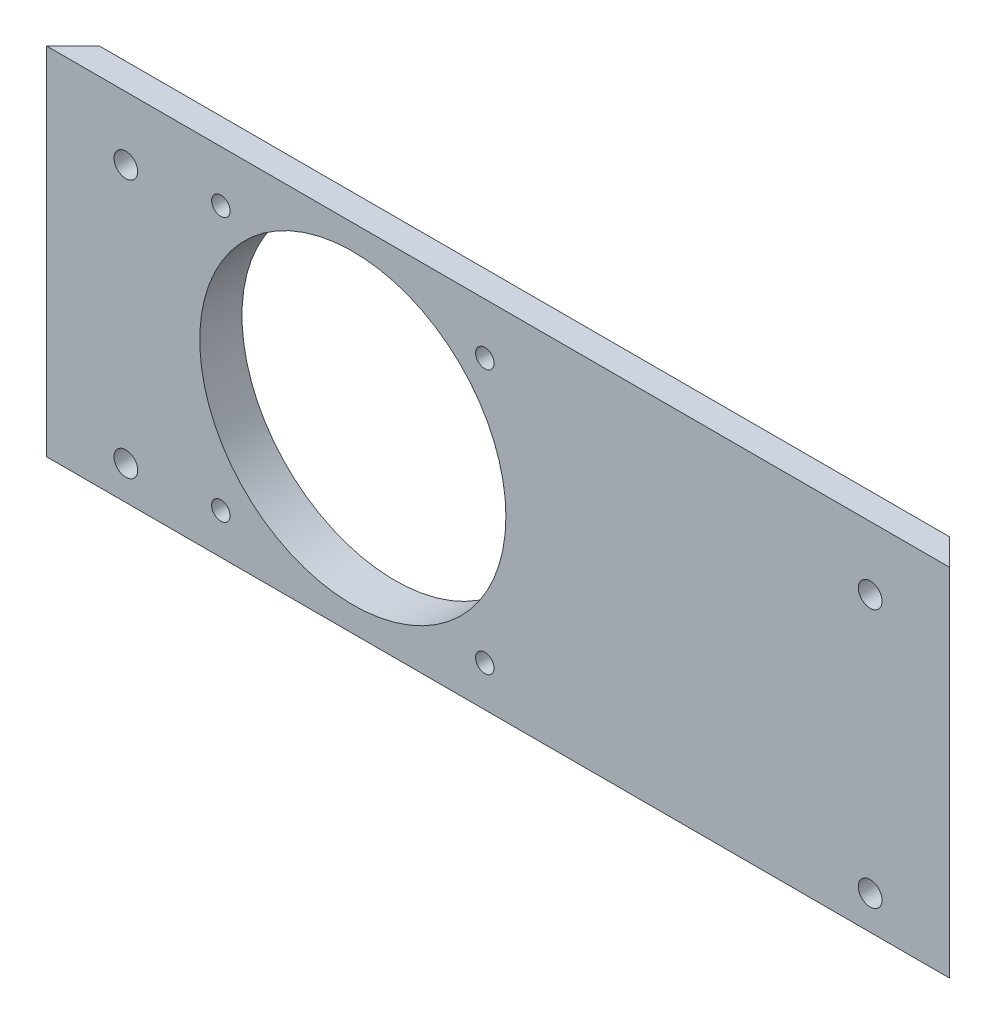
ISO-10303-21;
HEADER;
FILE_DESCRIPTION(('STEP AP214'),'2;1');
FILE_NAME('part.step','',(''),(''),'','','');
FILE_SCHEMA(('AUTOMOTIVE_DESIGN { 1 0 10303 214 1 1 1 1 }'));
ENDSEC;
DATA;
#1=APPLICATION_CONTEXT('core data for automotive mechanical design processes');
#2=APPLICATION_PROTOCOL_DEFINITION('international standard','automotive_design',2000,#1);
#3=PRODUCT_CONTEXT('',#1,'mechanical');
#4=PRODUCT('Part','Part','',(#3));
#5=PRODUCT_RELATED_PRODUCT_CATEGORY('part','',(#4));
#6=PRODUCT_DEFINITION_FORMATION('','',#4);
#7=PRODUCT_DEFINITION_CONTEXT('part definition',#1,'design');
#8=PRODUCT_DEFINITION('design','',#6,#7);
#9=PRODUCT_DEFINITION_SHAPE('','',#8);
#10=(LENGTH_UNIT() NAMED_UNIT(*) SI_UNIT(.MILLI.,.METRE.));
#11=(NAMED_UNIT(*) PLANE_ANGLE_UNIT() SI_UNIT($,.RADIAN.));
#12=(NAMED_UNIT(*) SI_UNIT($,.STERADIAN.) SOLID_ANGLE_UNIT());
#13=UNCERTAINTY_MEASURE_WITH_UNIT(LENGTH_MEASURE(1.E-05),#10,'distance_accuracy_value','');
#14=(GEOMETRIC_REPRESENTATION_CONTEXT(3) GLOBAL_UNCERTAINTY_ASSIGNED_CONTEXT((#13)) GLOBAL_UNIT_ASSIGNED_CONTEXT((#10,
#11,#12)) REPRESENTATION_CONTEXT('',''));
#15=CARTESIAN_POINT('',(0.,0.,0.));
#16=DIRECTION('',(0.,0.,1.));
#17=DIRECTION('',(1.,0.,0.));
#18=AXIS2_PLACEMENT_3D('',#15,#16,#17);
#19=CARTESIAN_POINT('',(0.,70.,-5.));
#20=DIRECTION('',(0.,1.,0.));
#21=DIRECTION('',(0.,0.,1.));
#22=AXIS2_PLACEMENT_3D('',#19,#20,#21);
#23=PLANE('',#22);
#24=DIRECTION('',(-0.707106781186546,0.,-0.707106781186549));
#25=VECTOR('',#24,1.);
#26=CARTESIAN_POINT('',(83.0000000000003,70.,-88.));
#27=LINE('',#26,#25);
#28=CARTESIAN_POINT('',(171.,70.,0.));
#29=VERTEX_POINT('',#28);
#30=CARTESIAN_POINT('',(166.,70.,-4.99999999999999));
#31=VERTEX_POINT('',#30);
#32=EDGE_CURVE('E130',#29,#31,#27,.T.);
#33=ORIENTED_EDGE('',*,*,#32,.T.);
#34=DIRECTION('',(-1.,0.,0.));
#35=VECTOR('',#34,1.);
#36=CARTESIAN_POINT('',(8.00000000000001,70.,-5.));
#37=LINE('',#36,#35);
#38=CARTESIAN_POINT('',(5.00000000000002,70.,-5.));
#39=VERTEX_POINT('',#38);
#40=EDGE_CURVE('E65',#31,#39,#37,.T.);
#41=ORIENTED_EDGE('',*,*,#40,.T.);
#42=DIRECTION('',(-0.707106781186546,0.,0.707106781186549));
#43=VECTOR('',#42,1.);
#44=CARTESIAN_POINT('',(2.50000000000002,70.,-2.49999999999999));
#45=LINE('',#44,#43);
#46=CARTESIAN_POINT('',(0.,70.,0.));
#47=VERTEX_POINT('',#46);
#48=EDGE_CURVE('E125',#39,#47,#45,.T.);
#49=ORIENTED_EDGE('',*,*,#48,.T.);
#50=DIRECTION('',(-1.,0.,0.));
#51=VECTOR('',#50,1.);
#52=CARTESIAN_POINT('',(0.,70.,0.));
#53=LINE('',#52,#51);
#54=EDGE_CURVE('E166',#29,#47,#53,.T.);
#55=ORIENTED_EDGE('',*,*,#54,.F.);
#56=EDGE_LOOP('',(#33,#41,#49,#55));
#57=FACE_BOUND('',#56,.T.);
#58=ADVANCED_FACE('F41',(#57),#23,.T.);
#59=CARTESIAN_POINT('',(0.,0.,-5.));
#60=DIRECTION('',(0.,0.,-1.));
#61=DIRECTION('',(-1.,0.,0.));
#62=AXIS2_PLACEMENT_3D('',#59,#60,#61);
#63=PLANE('',#62);
#64=DIRECTION('',(1.,0.,0.));
#65=VECTOR('',#64,1.);
#66=CARTESIAN_POINT('',(-5.,2.59999999999997,-4.99999999999988));
#67=LINE('',#66,#65);
#68=CARTESIAN_POINT('',(4.9999999999999,2.59999999999997,-4.99999999999988));
#69=VERTEX_POINT('',#68);
#70=CARTESIAN_POINT('',(166.,2.59999999999997,-4.99999999999988));
#71=VERTEX_POINT('',#70);
#72=EDGE_CURVE('E100',#69,#71,#67,.T.);
#73=ORIENTED_EDGE('',*,*,#72,.F.);
#74=DIRECTION('',(0.,1.,0.));
#75=VECTOR('',#74,1.);
#76=CARTESIAN_POINT('',(5.00000000000002,0.,-5.));
#77=LINE('',#76,#75);
#78=CARTESIAN_POINT('',(5.00000000000002,5.,-5.));
#79=VERTEX_POINT('',#78);
#80=EDGE_CURVE('E126',#69,#79,#77,.T.);
#81=ORIENTED_EDGE('',*,*,#80,.T.);
#82=DIRECTION('',(-1.,0.,0.));
#83=VECTOR('',#82,1.);
#84=CARTESIAN_POINT('',(0.,5.,-5.));
#85=LINE('',#84,#83);
#86=CARTESIAN_POINT('',(166.,4.99999999999997,-5.));
#87=VERTEX_POINT('',#86);
#88=EDGE_CURVE('E123',#87,#79,#85,.T.);
#89=ORIENTED_EDGE('',*,*,#88,.F.);
#90=DIRECTION('',(0.,-1.,0.));
#91=VECTOR('',#90,1.);
#92=CARTESIAN_POINT('',(166.,0.,-5.));
#93=LINE('',#92,#91);
#94=EDGE_CURVE('E114',#87,#71,#93,.T.);
#95=ORIENTED_EDGE('',*,*,#94,.T.);
#96=EDGE_LOOP('',(#73,#81,#89,#95));
#97=FACE_BOUND('',#96,.T.);
#98=ADVANCED_FACE('F121',(#97),#63,.T.);
#99=CARTESIAN_POINT('',(0.,0.,0.));
#100=DIRECTION('',(0.,0.,-1.));
#101=DIRECTION('',(-1.,0.,0.));
#102=AXIS2_PLACEMENT_3D('',#99,#100,#101);
#103=PLANE('',#102);
#104=CARTESIAN_POINT('',(33.0000000000004,10.3,0.));
#105=DIRECTION('',(0.,0.,1.));
#106=DIRECTION('',(1.,0.,0.));
#107=AXIS2_PLACEMENT_3D('',#104,#105,#106);
#108=CIRCLE('',#107,1.75);
#109=CARTESIAN_POINT('',(34.7500000000004,10.3,0.));
#110=VERTEX_POINT('',#109);
#111=EDGE_CURVE('E374',#110,#110,#108,.T.);
#112=ORIENTED_EDGE('',*,*,#111,.F.);
#113=EDGE_LOOP('',(#112));
#114=FACE_BOUND('',#113,.T.);
#115=CARTESIAN_POINT('',(83.0000000000004,10.3,0.));
#116=DIRECTION('',(0.,0.,1.));
#117=DIRECTION('',(1.,0.,0.));
#118=AXIS2_PLACEMENT_3D('',#115,#116,#117);
#119=CIRCLE('',#118,1.75);
#120=CARTESIAN_POINT('',(84.7500000000004,10.3,0.));
#121=VERTEX_POINT('',#120);
#122=EDGE_CURVE('E378',#121,#121,#119,.T.);
#123=ORIENTED_EDGE('',*,*,#122,.F.);
#124=EDGE_LOOP('',(#123));
#125=FACE_BOUND('',#124,.T.);
#126=CARTESIAN_POINT('',(82.9999999999999,60.3,0.));
#127=DIRECTION('',(0.,0.,1.));
#128=DIRECTION('',(1.,0.,0.));
#129=AXIS2_PLACEMENT_3D('',#126,#127,#128);
#130=CIRCLE('',#129,1.75);
#131=CARTESIAN_POINT('',(84.7499999999999,60.3,0.));
#132=VERTEX_POINT('',#131);
#133=EDGE_CURVE('E404',#132,#132,#130,.T.);
#134=ORIENTED_EDGE('',*,*,#133,.F.);
#135=EDGE_LOOP('',(#134));
#136=FACE_BOUND('',#135,.T.);
#137=CARTESIAN_POINT('',(32.9999999999999,60.3,0.));
#138=DIRECTION('',(0.,0.,1.));
#139=DIRECTION('',(1.,0.,0.));
#140=AXIS2_PLACEMENT_3D('',#137,#138,#139);
#141=CIRCLE('',#140,1.75);
#142=CARTESIAN_POINT('',(34.7499999999999,60.3,0.));
#143=VERTEX_POINT('',#142);
#144=EDGE_CURVE('E392',#143,#143,#141,.T.);
#145=ORIENTED_EDGE('',*,*,#144,.F.);
#146=EDGE_LOOP('',(#145));
#147=FACE_BOUND('',#146,.T.);
#148=CARTESIAN_POINT('',(57.9999999999999,36.3,0.));
#149=DIRECTION('',(0.,0.,1.));
#150=DIRECTION('',(1.,0.,0.));
#151=AXIS2_PLACEMENT_3D('',#148,#149,#150);
#152=CIRCLE('',#151,29.);
#153=CARTESIAN_POINT('',(86.9999999999999,36.3,0.));
#154=VERTEX_POINT('',#153);
#155=EDGE_CURVE('E384',#154,#154,#152,.T.);
#156=ORIENTED_EDGE('',*,*,#155,.F.);
#157=EDGE_LOOP('',(#156));
#158=FACE_BOUND('',#157,.T.);
#159=CARTESIAN_POINT('',(156.,58.,0.));
#160=DIRECTION('',(0.,0.,1.));
#161=DIRECTION('',(-1.,0.,0.));
#162=AXIS2_PLACEMENT_3D('',#159,#160,#161);
#163=CIRCLE('',#162,2.25000000000004);
#164=CARTESIAN_POINT('',(153.75,58.,0.));
#165=VERTEX_POINT('',#164);
#166=EDGE_CURVE('E187',#165,#165,#163,.T.);
#167=ORIENTED_EDGE('',*,*,#166,.F.);
#168=EDGE_LOOP('',(#167));
#169=FACE_BOUND('',#168,.T.);
#170=CARTESIAN_POINT('',(15.,58.,0.));
#171=DIRECTION('',(0.,0.,1.));
#172=DIRECTION('',(1.,0.,0.));
#173=AXIS2_PLACEMENT_3D('',#170,#171,#172);
#174=CIRCLE('',#173,2.25);
#175=CARTESIAN_POINT('',(17.25,58.,0.));
#176=VERTEX_POINT('',#175);
#177=EDGE_CURVE('E192',#176,#176,#174,.T.);
#178=ORIENTED_EDGE('',*,*,#177,.F.);
#179=EDGE_LOOP('',(#178));
#180=FACE_BOUND('',#179,.T.);
#181=CARTESIAN_POINT('',(156.,9.,0.));
#182=DIRECTION('',(0.,0.,1.));
#183=DIRECTION('',(-1.,0.,0.));
#184=AXIS2_PLACEMENT_3D('',#181,#182,#183);
#185=CIRCLE('',#184,2.25000000000004);
#186=CARTESIAN_POINT('',(153.75,9.,0.));
#187=VERTEX_POINT('',#186);
#188=EDGE_CURVE('E202',#187,#187,#185,.T.);
#189=ORIENTED_EDGE('',*,*,#188,.F.);
#190=EDGE_LOOP('',(#189));
#191=FACE_BOUND('',#190,.T.);
#192=CARTESIAN_POINT('',(15.,9.,0.));
#193=DIRECTION('',(0.,0.,1.));
#194=DIRECTION('',(1.,0.,0.));
#195=AXIS2_PLACEMENT_3D('',#192,#193,#194);
#196=CIRCLE('',#195,2.25);
#197=CARTESIAN_POINT('',(17.25,9.,0.));
#198=VERTEX_POINT('',#197);
#199=EDGE_CURVE('E206',#198,#198,#196,.T.);
#200=ORIENTED_EDGE('',*,*,#199,.F.);
#201=EDGE_LOOP('',(#200));
#202=FACE_BOUND('',#201,.T.);
#203=DIRECTION('',(0.,-1.,0.));
#204=VECTOR('',#203,1.);
#205=CARTESIAN_POINT('',(0.,0.,0.));
#206=LINE('',#205,#204);
#207=CARTESIAN_POINT('',(0.,2.59999999999997,0.));
#208=VERTEX_POINT('',#207);
#209=EDGE_CURVE('E175',#47,#208,#206,.T.);
#210=ORIENTED_EDGE('',*,*,#209,.T.);
#211=DIRECTION('',(1.,0.,0.));
#212=VECTOR('',#211,1.);
#213=CARTESIAN_POINT('',(0.,2.59999999999997,1.38777878078145E-13));
#214=LINE('',#213,#212);
#215=CARTESIAN_POINT('',(171.,2.59999999999997,1.38777878078145E-13));
#216=VERTEX_POINT('',#215);
#217=EDGE_CURVE('E57',#208,#216,#214,.T.);
#218=ORIENTED_EDGE('',*,*,#217,.T.);
#219=DIRECTION('',(0.,1.,0.));
#220=VECTOR('',#219,1.);
#221=CARTESIAN_POINT('',(171.,0.,0.));
#222=LINE('',#221,#220);
#223=EDGE_CURVE('E116',#216,#29,#222,.T.);
#224=ORIENTED_EDGE('',*,*,#223,.T.);
#225=ORIENTED_EDGE('',*,*,#54,.T.);
#226=EDGE_LOOP('',(#210,#218,#224,#225));
#227=FACE_BOUND('',#226,.T.);
#228=ADVANCED_FACE('F210',(#114,#125,#136,#147,#158,#169,#180,#191,#202,#227),#103,.F.);
#229=CARTESIAN_POINT('',(15.,9.,-5.));
#230=DIRECTION('',(0.,0.,1.));
#231=DIRECTION('',(1.,0.,0.));
#232=AXIS2_PLACEMENT_3D('',#229,#230,#231);
#233=CYLINDRICAL_SURFACE('',#232,2.25);
#234=ORIENTED_EDGE('',*,*,#199,.T.);
#235=EDGE_LOOP('',(#234));
#236=FACE_BOUND('',#235,.T.);
#237=CARTESIAN_POINT('',(15.,9.,-8.));
#238=DIRECTION('',(0.,0.,-1.));
#239=DIRECTION('',(-1.,0.,0.));
#240=AXIS2_PLACEMENT_3D('',#237,#238,#239);
#241=CIRCLE('',#240,2.25);
#242=CARTESIAN_POINT('',(12.75,9.,-8.));
#243=VERTEX_POINT('',#242);
#244=EDGE_CURVE('E222',#243,#243,#241,.T.);
#245=ORIENTED_EDGE('',*,*,#244,.T.);
#246=EDGE_LOOP('',(#245));
#247=FACE_BOUND('',#246,.T.);
#248=ADVANCED_FACE('F313',(#236,#247),#233,.F.);
#249=CARTESIAN_POINT('',(156.,9.,-5.));
#250=DIRECTION('',(0.,0.,1.));
#251=DIRECTION('',(1.,0.,0.));
#252=AXIS2_PLACEMENT_3D('',#249,#250,#251);
#253=CYLINDRICAL_SURFACE('',#252,2.25000000000004);
#254=ORIENTED_EDGE('',*,*,#188,.T.);
#255=EDGE_LOOP('',(#254));
#256=FACE_BOUND('',#255,.T.);
#257=CARTESIAN_POINT('',(156.,9.,-8.));
#258=DIRECTION('',(0.,0.,-1.));
#259=DIRECTION('',(-1.,0.,0.));
#260=AXIS2_PLACEMENT_3D('',#257,#258,#259);
#261=CIRCLE('',#260,2.25000000000004);
#262=CARTESIAN_POINT('',(153.75,9.,-8.));
#263=VERTEX_POINT('',#262);
#264=EDGE_CURVE('E216',#263,#263,#261,.T.);
#265=ORIENTED_EDGE('',*,*,#264,.T.);
#266=EDGE_LOOP('',(#265));
#267=FACE_BOUND('',#266,.T.);
#268=ADVANCED_FACE('F248',(#256,#267),#253,.F.);
#269=CARTESIAN_POINT('',(15.,58.,-5.));
#270=DIRECTION('',(0.,0.,1.));
#271=DIRECTION('',(1.,0.,0.));
#272=AXIS2_PLACEMENT_3D('',#269,#270,#271);
#273=CYLINDRICAL_SURFACE('',#272,2.25);
#274=ORIENTED_EDGE('',*,*,#177,.T.);
#275=EDGE_LOOP('',(#274));
#276=FACE_BOUND('',#275,.T.);
#277=CARTESIAN_POINT('',(15.,58.,-8.));
#278=DIRECTION('',(0.,0.,-1.));
#279=DIRECTION('',(-1.,0.,0.));
#280=AXIS2_PLACEMENT_3D('',#277,#278,#279);
#281=CIRCLE('',#280,2.25000000000001);
#282=CARTESIAN_POINT('',(12.75,58.,-8.));
#283=VERTEX_POINT('',#282);
#284=EDGE_CURVE('E194',#283,#283,#281,.T.);
#285=ORIENTED_EDGE('',*,*,#284,.T.);
#286=EDGE_LOOP('',(#285));
#287=FACE_BOUND('',#286,.T.);
#288=ADVANCED_FACE('F231',(#276,#287),#273,.F.);
#289=CARTESIAN_POINT('',(156.,58.,-5.));
#290=DIRECTION('',(0.,0.,1.));
#291=DIRECTION('',(1.,0.,0.));
#292=AXIS2_PLACEMENT_3D('',#289,#290,#291);
#293=CYLINDRICAL_SURFACE('',#292,2.25000000000004);
#294=ORIENTED_EDGE('',*,*,#166,.T.);
#295=EDGE_LOOP('',(#294));
#296=FACE_BOUND('',#295,.T.);
#297=CARTESIAN_POINT('',(156.,58.,-8.));
#298=DIRECTION('',(0.,0.,-1.));
#299=DIRECTION('',(-1.,0.,0.));
#300=AXIS2_PLACEMENT_3D('',#297,#298,#299);
#301=CIRCLE('',#300,2.25000000000004);
#302=CARTESIAN_POINT('',(153.75,58.,-8.));
#303=VERTEX_POINT('',#302);
#304=EDGE_CURVE('E212',#303,#303,#301,.T.);
#305=ORIENTED_EDGE('',*,*,#304,.T.);
#306=EDGE_LOOP('',(#305));
#307=FACE_BOUND('',#306,.T.);
#308=ADVANCED_FACE('F234',(#296,#307),#293,.F.);
#309=CARTESIAN_POINT('',(0.,0.,-8.));
#310=DIRECTION('',(0.,0.,1.));
#311=DIRECTION('',(1.,0.,0.));
#312=AXIS2_PLACEMENT_3D('',#309,#310,#311);
#313=PLANE('',#312);
#314=CARTESIAN_POINT('',(33.0000000000004,10.3,-8.));
#315=DIRECTION('',(0.,0.,1.));
#316=DIRECTION('',(1.,0.,0.));
#317=AXIS2_PLACEMENT_3D('',#314,#315,#316);
#318=CIRCLE('',#317,1.75);
#319=CARTESIAN_POINT('',(34.7500000000004,10.3,-8.));
#320=VERTEX_POINT('',#319);
#321=EDGE_CURVE('E371',#320,#320,#318,.T.);
#322=ORIENTED_EDGE('',*,*,#321,.T.);
#323=EDGE_LOOP('',(#322));
#324=FACE_BOUND('',#323,.T.);
#325=CARTESIAN_POINT('',(83.0000000000004,10.3,-8.));
#326=DIRECTION('',(0.,0.,1.));
#327=DIRECTION('',(1.,0.,0.));
#328=AXIS2_PLACEMENT_3D('',#325,#326,#327);
#329=CIRCLE('',#328,1.75);
#330=CARTESIAN_POINT('',(84.7500000000004,10.3,-8.));
#331=VERTEX_POINT('',#330);
#332=EDGE_CURVE('E408',#331,#331,#329,.T.);
#333=ORIENTED_EDGE('',*,*,#332,.T.);
#334=EDGE_LOOP('',(#333));
#335=FACE_BOUND('',#334,.T.);
#336=CARTESIAN_POINT('',(82.9999999999999,60.3,-8.));
#337=DIRECTION('',(0.,0.,1.));
#338=DIRECTION('',(1.,0.,0.));
#339=AXIS2_PLACEMENT_3D('',#336,#337,#338);
#340=CIRCLE('',#339,1.75);
#341=CARTESIAN_POINT('',(84.7499999999999,60.3,-8.));
#342=VERTEX_POINT('',#341);
#343=EDGE_CURVE('E398',#342,#342,#340,.T.);
#344=ORIENTED_EDGE('',*,*,#343,.T.);
#345=EDGE_LOOP('',(#344));
#346=FACE_BOUND('',#345,.T.);
#347=CARTESIAN_POINT('',(32.9999999999999,60.3,-8.));
#348=DIRECTION('',(0.,0.,1.));
#349=DIRECTION('',(1.,0.,0.));
#350=AXIS2_PLACEMENT_3D('',#347,#348,#349);
#351=CIRCLE('',#350,1.75);
#352=CARTESIAN_POINT('',(34.7499999999999,60.3,-8.));
#353=VERTEX_POINT('',#352);
#354=EDGE_CURVE('E387',#353,#353,#351,.T.);
#355=ORIENTED_EDGE('',*,*,#354,.T.);
#356=EDGE_LOOP('',(#355));
#357=FACE_BOUND('',#356,.T.);
#358=CARTESIAN_POINT('',(57.9999999999999,36.3,-8.));
#359=DIRECTION('',(0.,0.,1.));
#360=DIRECTION('',(1.,0.,0.));
#361=AXIS2_PLACEMENT_3D('',#358,#359,#360);
#362=CIRCLE('',#361,29.);
#363=CARTESIAN_POINT('',(86.9999999999999,36.3,-8.));
#364=VERTEX_POINT('',#363);
#365=EDGE_CURVE('E118',#364,#364,#362,.T.);
#366=ORIENTED_EDGE('',*,*,#365,.T.);
#367=EDGE_LOOP('',(#366));
#368=FACE_BOUND('',#367,.T.);
#369=DIRECTION('',(0.,1.,0.));
#370=VECTOR('',#369,1.);
#371=CARTESIAN_POINT('',(8.00000000000001,70.,-8.));
#372=LINE('',#371,#370);
#373=CARTESIAN_POINT('',(8.00000000000001,5.,-8.));
#374=VERTEX_POINT('',#373);
#375=CARTESIAN_POINT('',(8.00000000000001,67.,-8.));
#376=VERTEX_POINT('',#375);
#377=EDGE_CURVE('E153',#374,#376,#372,.T.);
#378=ORIENTED_EDGE('',*,*,#377,.T.);
#379=DIRECTION('',(1.,0.,0.));
#380=VECTOR('',#379,1.);
#381=CARTESIAN_POINT('',(163.,67.,-8.));
#382=LINE('',#381,#380);
#383=CARTESIAN_POINT('',(163.,67.,-8.));
#384=VERTEX_POINT('',#383);
#385=EDGE_CURVE('E138',#376,#384,#382,.T.);
#386=ORIENTED_EDGE('',*,*,#385,.T.);
#387=DIRECTION('',(0.,-1.,0.));
#388=VECTOR('',#387,1.);
#389=CARTESIAN_POINT('',(163.,4.99999999999997,-8.));
#390=LINE('',#389,#388);
#391=CARTESIAN_POINT('',(163.,4.99999999999997,-8.));
#392=VERTEX_POINT('',#391);
#393=EDGE_CURVE('E165',#384,#392,#390,.T.);
#394=ORIENTED_EDGE('',*,*,#393,.T.);
#395=DIRECTION('',(-1.,0.,0.));
#396=VECTOR('',#395,1.);
#397=CARTESIAN_POINT('',(0.,5.,-8.));
#398=LINE('',#397,#396);
#399=EDGE_CURVE('E163',#392,#374,#398,.T.);
#400=ORIENTED_EDGE('',*,*,#399,.T.);
#401=EDGE_LOOP('',(#378,#386,#394,#400));
#402=FACE_BOUND('',#401,.T.);
#403=ORIENTED_EDGE('',*,*,#284,.F.);
#404=EDGE_LOOP('',(#403));
#405=FACE_BOUND('',#404,.T.);
#406=ORIENTED_EDGE('',*,*,#244,.F.);
#407=EDGE_LOOP('',(#406));
#408=FACE_BOUND('',#407,.T.);
#409=ORIENTED_EDGE('',*,*,#264,.F.);
#410=EDGE_LOOP('',(#409));
#411=FACE_BOUND('',#410,.T.);
#412=ORIENTED_EDGE('',*,*,#304,.F.);
#413=EDGE_LOOP('',(#412));
#414=FACE_BOUND('',#413,.T.);
#415=ADVANCED_FACE('F159',(#324,#335,#346,#357,#368,#402,#405,#408,#411,#414),#313,.F.);
#416=CARTESIAN_POINT('',(0.,5.,-8.));
#417=DIRECTION('',(0.,1.,0.));
#418=DIRECTION('',(-1.,0.,0.));
#419=AXIS2_PLACEMENT_3D('',#416,#417,#418);
#420=PLANE('',#419);
#421=ORIENTED_EDGE('',*,*,#399,.F.);
#422=DIRECTION('',(0.707106781186546,0.,0.707106781186549));
#423=VECTOR('',#422,1.);
#424=CARTESIAN_POINT('',(163.,4.99999999999997,-8.));
#425=LINE('',#424,#423);
#426=EDGE_CURVE('E132',#392,#87,#425,.T.);
#427=ORIENTED_EDGE('',*,*,#426,.T.);
#428=ORIENTED_EDGE('',*,*,#88,.T.);
#429=DIRECTION('',(0.707106781186546,0.,-0.707106781186549));
#430=VECTOR('',#429,1.);
#431=CARTESIAN_POINT('',(8.00000000000001,5.,-8.));
#432=LINE('',#431,#430);
#433=EDGE_CURVE('E181',#79,#374,#432,.T.);
#434=ORIENTED_EDGE('',*,*,#433,.T.);
#435=EDGE_LOOP('',(#421,#427,#428,#434));
#436=FACE_BOUND('',#435,.T.);
#437=ADVANCED_FACE('F185',(#436),#420,.F.);
#438=CARTESIAN_POINT('',(163.,0.,-8.));
#439=DIRECTION('',(0.707106781186549,0.,-0.707106781186546));
#440=DIRECTION('',(0.,1.,0.));
#441=AXIS2_PLACEMENT_3D('',#438,#439,#440);
#442=PLANE('',#441);
#443=DIRECTION('',(0.707106781186547,0.,0.707106781186549));
#444=VECTOR('',#443,1.);
#445=CARTESIAN_POINT('',(171.,2.59999999999997,1.38777878078145E-13));
#446=LINE('',#445,#444);
#447=EDGE_CURVE('E103',#71,#216,#446,.T.);
#448=ORIENTED_EDGE('',*,*,#447,.F.);
#449=ORIENTED_EDGE('',*,*,#94,.F.);
#450=ORIENTED_EDGE('',*,*,#426,.F.);
#451=ORIENTED_EDGE('',*,*,#393,.F.);
#452=DIRECTION('',(0.577350269189624,0.577350269189627,0.577350269189626));
#453=VECTOR('',#452,1.);
#454=CARTESIAN_POINT('',(140.666666666667,44.6666666666666,-30.3333333333334));
#455=LINE('',#454,#453);
#456=EDGE_CURVE('E142',#384,#31,#455,.T.);
#457=ORIENTED_EDGE('',*,*,#456,.T.);
#458=ORIENTED_EDGE('',*,*,#32,.F.);
#459=ORIENTED_EDGE('',*,*,#223,.F.);
#460=EDGE_LOOP('',(#448,#449,#450,#451,#457,#458,#459));
#461=FACE_BOUND('',#460,.T.);
#462=ADVANCED_FACE('F112',(#461),#442,.T.);
#463=CARTESIAN_POINT('',(8.00000000000001,0.,-8.));
#464=DIRECTION('',(-0.707106781186549,0.,-0.707106781186546));
#465=DIRECTION('',(0.,-1.,0.));
#466=AXIS2_PLACEMENT_3D('',#463,#464,#465);
#467=PLANE('',#466);
#468=DIRECTION('',(0.707106781186546,0.,-0.707106781186549));
#469=VECTOR('',#468,1.);
#470=CARTESIAN_POINT('',(8.00000000000001,2.59999999999997,-8.));
#471=LINE('',#470,#469);
#472=EDGE_CURVE('E11',#208,#69,#471,.T.);
#473=ORIENTED_EDGE('',*,*,#472,.F.);
#474=ORIENTED_EDGE('',*,*,#209,.F.);
#475=ORIENTED_EDGE('',*,*,#48,.F.);
#476=DIRECTION('',(0.577350269189624,-0.577350269189627,-0.577350269189626));
#477=VECTOR('',#476,1.);
#478=CARTESIAN_POINT('',(30.3333333333333,44.6666666666666,-30.3333333333334));
#479=LINE('',#478,#477);
#480=EDGE_CURVE('E51',#39,#376,#479,.T.);
#481=ORIENTED_EDGE('',*,*,#480,.T.);
#482=ORIENTED_EDGE('',*,*,#377,.F.);
#483=ORIENTED_EDGE('',*,*,#433,.F.);
#484=ORIENTED_EDGE('',*,*,#80,.F.);
#485=EDGE_LOOP('',(#473,#474,#475,#481,#482,#483,#484));
#486=FACE_BOUND('',#485,.T.);
#487=ADVANCED_FACE('F151',(#486),#467,.T.);
#488=CARTESIAN_POINT('',(0.,67.,-8.));
#489=DIRECTION('',(0.,0.707106781186547,-0.707106781186548));
#490=DIRECTION('',(-1.,0.,0.));
#491=AXIS2_PLACEMENT_3D('',#488,#489,#490);
#492=PLANE('',#491);
#493=ORIENTED_EDGE('',*,*,#480,.F.);
#494=ORIENTED_EDGE('',*,*,#40,.F.);
#495=ORIENTED_EDGE('',*,*,#456,.F.);
#496=ORIENTED_EDGE('',*,*,#385,.F.);
#497=EDGE_LOOP('',(#493,#494,#495,#496));
#498=FACE_BOUND('',#497,.T.);
#499=ADVANCED_FACE('F44',(#498),#492,.T.);
#500=CARTESIAN_POINT('',(0.,2.59999999999997,1.38777878078145E-13));
#501=DIRECTION('',(0.,1.,0.));
#502=DIRECTION('',(-1.,0.,0.));
#503=AXIS2_PLACEMENT_3D('',#500,#501,#502);
#504=PLANE('',#503);
#505=ORIENTED_EDGE('',*,*,#472,.T.);
#506=ORIENTED_EDGE('',*,*,#72,.T.);
#507=ORIENTED_EDGE('',*,*,#447,.T.);
#508=ORIENTED_EDGE('',*,*,#217,.F.);
#509=EDGE_LOOP('',(#505,#506,#507,#508));
#510=FACE_BOUND('',#509,.T.);
#511=ADVANCED_FACE('F102',(#510),#504,.F.);
#512=CARTESIAN_POINT('',(57.9999999999999,36.3,-8.));
#513=DIRECTION('',(0.,0.,1.));
#514=DIRECTION('',(1.,0.,0.));
#515=AXIS2_PLACEMENT_3D('',#512,#513,#514);
#516=CYLINDRICAL_SURFACE('',#515,29.);
#517=ORIENTED_EDGE('',*,*,#365,.F.);
#518=EDGE_LOOP('',(#517));
#519=FACE_BOUND('',#518,.T.);
#520=ORIENTED_EDGE('',*,*,#155,.T.);
#521=EDGE_LOOP('',(#520));
#522=FACE_BOUND('',#521,.T.);
#523=ADVANCED_FACE('F274',(#519,#522),#516,.F.);
#524=CARTESIAN_POINT('',(32.9999999999999,60.3,-8.));
#525=DIRECTION('',(0.,0.,1.));
#526=DIRECTION('',(1.,0.,0.));
#527=AXIS2_PLACEMENT_3D('',#524,#525,#526);
#528=CYLINDRICAL_SURFACE('',#527,1.75);
#529=ORIENTED_EDGE('',*,*,#354,.F.);
#530=EDGE_LOOP('',(#529));
#531=FACE_BOUND('',#530,.T.);
#532=ORIENTED_EDGE('',*,*,#144,.T.);
#533=EDGE_LOOP('',(#532));
#534=FACE_BOUND('',#533,.T.);
#535=ADVANCED_FACE('F279',(#531,#534),#528,.F.);
#536=CARTESIAN_POINT('',(82.9999999999999,60.3,-8.));
#537=DIRECTION('',(0.,0.,1.));
#538=DIRECTION('',(1.,0.,0.));
#539=AXIS2_PLACEMENT_3D('',#536,#537,#538);
#540=CYLINDRICAL_SURFACE('',#539,1.75);
#541=ORIENTED_EDGE('',*,*,#343,.F.);
#542=EDGE_LOOP('',(#541));
#543=FACE_BOUND('',#542,.T.);
#544=ORIENTED_EDGE('',*,*,#133,.T.);
#545=EDGE_LOOP('',(#544));
#546=FACE_BOUND('',#545,.T.);
#547=ADVANCED_FACE('F335',(#543,#546),#540,.F.);
#548=CARTESIAN_POINT('',(83.0000000000004,10.3,-8.));
#549=DIRECTION('',(0.,0.,1.));
#550=DIRECTION('',(1.,0.,0.));
#551=AXIS2_PLACEMENT_3D('',#548,#549,#550);
#552=CYLINDRICAL_SURFACE('',#551,1.75);
#553=ORIENTED_EDGE('',*,*,#332,.F.);
#554=EDGE_LOOP('',(#553));
#555=FACE_BOUND('',#554,.T.);
#556=ORIENTED_EDGE('',*,*,#122,.T.);
#557=EDGE_LOOP('',(#556));
#558=FACE_BOUND('',#557,.T.);
#559=ADVANCED_FACE('F345',(#555,#558),#552,.F.);
#560=CARTESIAN_POINT('',(33.0000000000004,10.3,-8.));
#561=DIRECTION('',(0.,0.,1.));
#562=DIRECTION('',(1.,0.,0.));
#563=AXIS2_PLACEMENT_3D('',#560,#561,#562);
#564=CYLINDRICAL_SURFACE('',#563,1.75);
#565=ORIENTED_EDGE('',*,*,#321,.F.);
#566=EDGE_LOOP('',(#565));
#567=FACE_BOUND('',#566,.T.);
#568=ORIENTED_EDGE('',*,*,#111,.T.);
#569=EDGE_LOOP('',(#568));
#570=FACE_BOUND('',#569,.T.);
#571=ADVANCED_FACE('F355',(#567,#570),#564,.F.);
#572=CLOSED_SHELL('',(#58,#98,#228,#248,#268,#288,#308,#415,#437,#462,#487,#499,#511,#523,#535,
#547,#559,#571));
#573=MANIFOLD_SOLID_BREP('B2',#572);
#574=ADVANCED_BREP_SHAPE_REPRESENTATION('',(#18,#573),#14);
#575=SHAPE_DEFINITION_REPRESENTATION(#9,#574);
ENDSEC;
END-ISO-10303-21;
